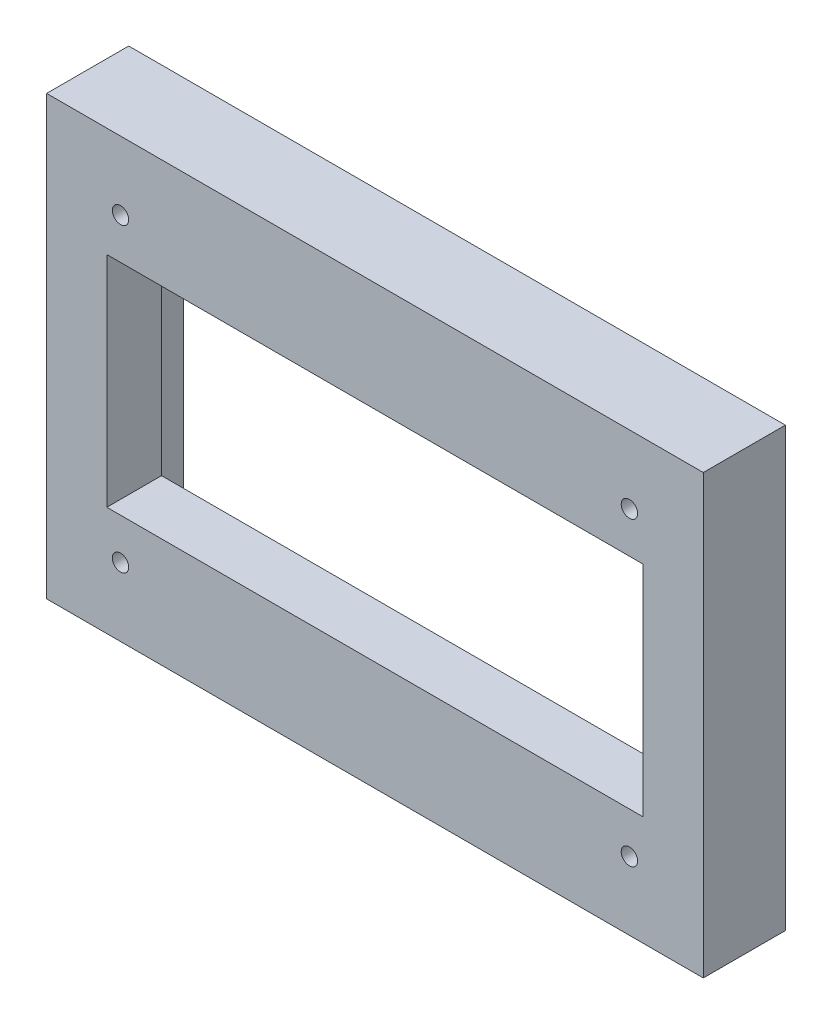
ISO-10303-21;
HEADER;
FILE_DESCRIPTION(('STEP AP214'),'2;1');
FILE_NAME('part.step','',(''),(''),'','','');
FILE_SCHEMA(('AUTOMOTIVE_DESIGN { 1 0 10303 214 1 1 1 1 }'));
ENDSEC;
DATA;
#1=APPLICATION_CONTEXT('core data for automotive mechanical design processes');
#2=APPLICATION_PROTOCOL_DEFINITION('international standard','automotive_design',2000,#1);
#3=PRODUCT_CONTEXT('',#1,'mechanical');
#4=PRODUCT('Part','Part','',(#3));
#5=PRODUCT_RELATED_PRODUCT_CATEGORY('part','',(#4));
#6=PRODUCT_DEFINITION_FORMATION('','',#4);
#7=PRODUCT_DEFINITION_CONTEXT('part definition',#1,'design');
#8=PRODUCT_DEFINITION('design','',#6,#7);
#9=PRODUCT_DEFINITION_SHAPE('','',#8);
#10=(LENGTH_UNIT() NAMED_UNIT(*) SI_UNIT(.MILLI.,.METRE.));
#11=(NAMED_UNIT(*) PLANE_ANGLE_UNIT() SI_UNIT($,.RADIAN.));
#12=(NAMED_UNIT(*) SI_UNIT($,.STERADIAN.) SOLID_ANGLE_UNIT());
#13=UNCERTAINTY_MEASURE_WITH_UNIT(LENGTH_MEASURE(1.E-05),#10,'distance_accuracy_value','');
#14=(GEOMETRIC_REPRESENTATION_CONTEXT(3) GLOBAL_UNCERTAINTY_ASSIGNED_CONTEXT((#13)) GLOBAL_UNIT_ASSIGNED_CONTEXT((#10,
#11,#12)) REPRESENTATION_CONTEXT('',''));
#15=CARTESIAN_POINT('',(0.,0.,0.));
#16=DIRECTION('',(0.,0.,1.));
#17=DIRECTION('',(1.,0.,0.));
#18=AXIS2_PLACEMENT_3D('',#15,#16,#17);
#19=CARTESIAN_POINT('',(60.,40.,-10.));
#20=DIRECTION('',(1.,0.,0.));
#21=DIRECTION('',(0.,1.,0.));
#22=AXIS2_PLACEMENT_3D('',#19,#20,#21);
#23=PLANE('',#22);
#24=DIRECTION('',(0.,1.,0.));
#25=VECTOR('',#24,1.);
#26=CARTESIAN_POINT('',(60.,40.,0.));
#27=LINE('',#26,#25);
#28=CARTESIAN_POINT('',(60.,-40.,0.));
#29=VERTEX_POINT('',#28);
#30=CARTESIAN_POINT('',(60.,40.,0.));
#31=VERTEX_POINT('',#30);
#32=EDGE_CURVE('E209',#29,#31,#27,.T.);
#33=ORIENTED_EDGE('',*,*,#32,.F.);
#34=DIRECTION('',(0.,0.,1.));
#35=VECTOR('',#34,1.);
#36=CARTESIAN_POINT('',(60.,-40.,-10.));
#37=LINE('',#36,#35);
#38=CARTESIAN_POINT('',(60.,-40.,-15.));
#39=VERTEX_POINT('',#38);
#40=EDGE_CURVE('E228',#39,#29,#37,.T.);
#41=ORIENTED_EDGE('',*,*,#40,.F.);
#42=DIRECTION('',(0.,-1.,0.));
#43=VECTOR('',#42,1.);
#44=CARTESIAN_POINT('',(60.,40.,-15.));
#45=LINE('',#44,#43);
#46=CARTESIAN_POINT('',(60.,40.,-15.));
#47=VERTEX_POINT('',#46);
#48=EDGE_CURVE('E168',#47,#39,#45,.T.);
#49=ORIENTED_EDGE('',*,*,#48,.F.);
#50=DIRECTION('',(0.,0.,1.));
#51=VECTOR('',#50,1.);
#52=CARTESIAN_POINT('',(60.,40.,-10.));
#53=LINE('',#52,#51);
#54=EDGE_CURVE('E227',#47,#31,#53,.T.);
#55=ORIENTED_EDGE('',*,*,#54,.T.);
#56=EDGE_LOOP('',(#33,#41,#49,#55));
#57=FACE_BOUND('',#56,.T.);
#58=ADVANCED_FACE('F33',(#57),#23,.T.);
#59=CARTESIAN_POINT('',(-60.,-40.,-10.));
#60=DIRECTION('',(0.,-1.,0.));
#61=DIRECTION('',(0.,0.,-1.));
#62=AXIS2_PLACEMENT_3D('',#59,#60,#61);
#63=PLANE('',#62);
#64=DIRECTION('',(1.,0.,0.));
#65=VECTOR('',#64,1.);
#66=CARTESIAN_POINT('',(-60.,-40.,0.));
#67=LINE('',#66,#65);
#68=CARTESIAN_POINT('',(-60.,-40.,0.));
#69=VERTEX_POINT('',#68);
#70=EDGE_CURVE('E224',#69,#29,#67,.T.);
#71=ORIENTED_EDGE('',*,*,#70,.F.);
#72=DIRECTION('',(0.,0.,1.));
#73=VECTOR('',#72,1.);
#74=CARTESIAN_POINT('',(-60.,-40.,-10.));
#75=LINE('',#74,#73);
#76=CARTESIAN_POINT('',(-60.,-40.,-15.));
#77=VERTEX_POINT('',#76);
#78=EDGE_CURVE('E231',#77,#69,#75,.T.);
#79=ORIENTED_EDGE('',*,*,#78,.F.);
#80=DIRECTION('',(-1.,0.,0.));
#81=VECTOR('',#80,1.);
#82=CARTESIAN_POINT('',(60.,-40.,-15.));
#83=LINE('',#82,#81);
#84=EDGE_CURVE('E171',#39,#77,#83,.T.);
#85=ORIENTED_EDGE('',*,*,#84,.F.);
#86=ORIENTED_EDGE('',*,*,#40,.T.);
#87=EDGE_LOOP('',(#71,#79,#85,#86));
#88=FACE_BOUND('',#87,.T.);
#89=ADVANCED_FACE('F270',(#88),#63,.T.);
#90=CARTESIAN_POINT('',(-60.,40.,-10.));
#91=DIRECTION('',(-1.,0.,0.));
#92=DIRECTION('',(0.,-1.,0.));
#93=AXIS2_PLACEMENT_3D('',#90,#91,#92);
#94=PLANE('',#93);
#95=DIRECTION('',(0.,-1.,0.));
#96=VECTOR('',#95,1.);
#97=CARTESIAN_POINT('',(-60.,40.,0.));
#98=LINE('',#97,#96);
#99=CARTESIAN_POINT('',(-60.,40.,0.));
#100=VERTEX_POINT('',#99);
#101=EDGE_CURVE('E221',#100,#69,#98,.T.);
#102=ORIENTED_EDGE('',*,*,#101,.F.);
#103=DIRECTION('',(0.,0.,1.));
#104=VECTOR('',#103,1.);
#105=CARTESIAN_POINT('',(-60.,40.,-10.));
#106=LINE('',#105,#104);
#107=CARTESIAN_POINT('',(-60.,40.,-15.));
#108=VERTEX_POINT('',#107);
#109=EDGE_CURVE('E233',#108,#100,#106,.T.);
#110=ORIENTED_EDGE('',*,*,#109,.F.);
#111=DIRECTION('',(0.,1.,0.));
#112=VECTOR('',#111,1.);
#113=CARTESIAN_POINT('',(-60.,40.,-15.));
#114=LINE('',#113,#112);
#115=EDGE_CURVE('E161',#77,#108,#114,.T.);
#116=ORIENTED_EDGE('',*,*,#115,.F.);
#117=ORIENTED_EDGE('',*,*,#78,.T.);
#118=EDGE_LOOP('',(#102,#110,#116,#117));
#119=FACE_BOUND('',#118,.T.);
#120=ADVANCED_FACE('F275',(#119),#94,.T.);
#121=CARTESIAN_POINT('',(-60.,40.,-10.));
#122=DIRECTION('',(0.,1.,0.));
#123=DIRECTION('',(0.,0.,1.));
#124=AXIS2_PLACEMENT_3D('',#121,#122,#123);
#125=PLANE('',#124);
#126=DIRECTION('',(-1.,0.,0.));
#127=VECTOR('',#126,1.);
#128=CARTESIAN_POINT('',(-60.,40.,0.));
#129=LINE('',#128,#127);
#130=EDGE_CURVE('E218',#31,#100,#129,.T.);
#131=ORIENTED_EDGE('',*,*,#130,.F.);
#132=ORIENTED_EDGE('',*,*,#54,.F.);
#133=DIRECTION('',(1.,0.,0.));
#134=VECTOR('',#133,1.);
#135=CARTESIAN_POINT('',(60.,40.,-15.));
#136=LINE('',#135,#134);
#137=EDGE_CURVE('E164',#108,#47,#136,.T.);
#138=ORIENTED_EDGE('',*,*,#137,.F.);
#139=ORIENTED_EDGE('',*,*,#109,.T.);
#140=EDGE_LOOP('',(#131,#132,#138,#139));
#141=FACE_BOUND('',#140,.T.);
#142=ADVANCED_FACE('F265',(#141),#125,.T.);
#143=CARTESIAN_POINT('',(0.,0.,0.));
#144=DIRECTION('',(0.,0.,1.));
#145=DIRECTION('',(1.,0.,0.));
#146=AXIS2_PLACEMENT_3D('',#143,#144,#145);
#147=PLANE('',#146);
#148=CARTESIAN_POINT('',(-46.4999999999994,-27.5,0.));
#149=DIRECTION('',(0.,0.,1.));
#150=DIRECTION('',(1.,0.,0.));
#151=AXIS2_PLACEMENT_3D('',#148,#149,#150);
#152=CIRCLE('',#151,1.5);
#153=CARTESIAN_POINT('',(-44.9999999999994,-27.5,0.));
#154=VERTEX_POINT('',#153);
#155=EDGE_CURVE('E174',#154,#154,#152,.T.);
#156=ORIENTED_EDGE('',*,*,#155,.F.);
#157=EDGE_LOOP('',(#156));
#158=FACE_BOUND('',#157,.T.);
#159=CARTESIAN_POINT('',(46.5000000000006,-27.5,0.));
#160=DIRECTION('',(0.,0.,1.));
#161=DIRECTION('',(1.,0.,0.));
#162=AXIS2_PLACEMENT_3D('',#159,#160,#161);
#163=CIRCLE('',#162,1.5);
#164=CARTESIAN_POINT('',(48.0000000000006,-27.5,0.));
#165=VERTEX_POINT('',#164);
#166=EDGE_CURVE('E179',#165,#165,#163,.T.);
#167=ORIENTED_EDGE('',*,*,#166,.F.);
#168=EDGE_LOOP('',(#167));
#169=FACE_BOUND('',#168,.T.);
#170=CARTESIAN_POINT('',(46.5,27.5,0.));
#171=DIRECTION('',(0.,0.,1.));
#172=DIRECTION('',(1.,0.,0.));
#173=AXIS2_PLACEMENT_3D('',#170,#171,#172);
#174=CIRCLE('',#173,1.5);
#175=CARTESIAN_POINT('',(48.,27.5,0.));
#176=VERTEX_POINT('',#175);
#177=EDGE_CURVE('E175',#176,#176,#174,.T.);
#178=ORIENTED_EDGE('',*,*,#177,.F.);
#179=EDGE_LOOP('',(#178));
#180=FACE_BOUND('',#179,.T.);
#181=CARTESIAN_POINT('',(-46.5,27.5,0.));
#182=DIRECTION('',(0.,0.,1.));
#183=DIRECTION('',(1.,0.,0.));
#184=AXIS2_PLACEMENT_3D('',#181,#182,#183);
#185=CIRCLE('',#184,1.5);
#186=CARTESIAN_POINT('',(-45.,27.5,0.));
#187=VERTEX_POINT('',#186);
#188=EDGE_CURVE('E178',#187,#187,#185,.T.);
#189=ORIENTED_EDGE('',*,*,#188,.F.);
#190=EDGE_LOOP('',(#189));
#191=FACE_BOUND('',#190,.T.);
#192=DIRECTION('',(0.,1.,0.));
#193=VECTOR('',#192,1.);
#194=CARTESIAN_POINT('',(49.,0.,0.));
#195=LINE('',#194,#193);
#196=CARTESIAN_POINT('',(49.,-20.,0.));
#197=VERTEX_POINT('',#196);
#198=CARTESIAN_POINT('',(49.,20.,0.));
#199=VERTEX_POINT('',#198);
#200=EDGE_CURVE('E11',#197,#199,#195,.T.);
#201=ORIENTED_EDGE('',*,*,#200,.F.);
#202=DIRECTION('',(1.,0.,0.));
#203=VECTOR('',#202,1.);
#204=CARTESIAN_POINT('',(0.,-20.,0.));
#205=LINE('',#204,#203);
#206=CARTESIAN_POINT('',(-49.,-20.,0.));
#207=VERTEX_POINT('',#206);
#208=EDGE_CURVE('E230',#207,#197,#205,.T.);
#209=ORIENTED_EDGE('',*,*,#208,.F.);
#210=DIRECTION('',(0.,1.,0.));
#211=VECTOR('',#210,1.);
#212=CARTESIAN_POINT('',(-49.,0.,0.));
#213=LINE('',#212,#211);
#214=CARTESIAN_POINT('',(-49.,20.,0.));
#215=VERTEX_POINT('',#214);
#216=EDGE_CURVE('E237',#207,#215,#213,.T.);
#217=ORIENTED_EDGE('',*,*,#216,.T.);
#218=DIRECTION('',(1.,0.,0.));
#219=VECTOR('',#218,1.);
#220=CARTESIAN_POINT('',(0.,20.,0.));
#221=LINE('',#220,#219);
#222=EDGE_CURVE('E40',#215,#199,#221,.T.);
#223=ORIENTED_EDGE('',*,*,#222,.T.);
#224=EDGE_LOOP('',(#201,#209,#217,#223));
#225=FACE_BOUND('',#224,.T.);
#226=ORIENTED_EDGE('',*,*,#32,.T.);
#227=ORIENTED_EDGE('',*,*,#130,.T.);
#228=ORIENTED_EDGE('',*,*,#101,.T.);
#229=ORIENTED_EDGE('',*,*,#70,.T.);
#230=EDGE_LOOP('',(#226,#227,#228,#229));
#231=FACE_BOUND('',#230,.T.);
#232=ADVANCED_FACE('F242',(#158,#169,#180,#191,#225,#231),#147,.T.);
#233=CARTESIAN_POINT('',(49.,20.,5.));
#234=DIRECTION('',(1.,0.,0.));
#235=DIRECTION('',(0.,1.,0.));
#236=AXIS2_PLACEMENT_3D('',#233,#234,#235);
#237=PLANE('',#236);
#238=ORIENTED_EDGE('',*,*,#200,.T.);
#239=DIRECTION('',(0.,0.,-1.));
#240=VECTOR('',#239,1.);
#241=CARTESIAN_POINT('',(49.,20.,5.));
#242=LINE('',#241,#240);
#243=CARTESIAN_POINT('',(49.,20.,-10.));
#244=VERTEX_POINT('',#243);
#245=EDGE_CURVE('E206',#199,#244,#242,.T.);
#246=ORIENTED_EDGE('',*,*,#245,.T.);
#247=DIRECTION('',(0.,-1.,0.));
#248=VECTOR('',#247,1.);
#249=CARTESIAN_POINT('',(49.,20.,-10.));
#250=LINE('',#249,#248);
#251=CARTESIAN_POINT('',(49.,-20.,-10.));
#252=VERTEX_POINT('',#251);
#253=EDGE_CURVE('E186',#244,#252,#250,.T.);
#254=ORIENTED_EDGE('',*,*,#253,.T.);
#255=DIRECTION('',(0.,0.,-1.));
#256=VECTOR('',#255,1.);
#257=CARTESIAN_POINT('',(49.,-20.,5.));
#258=LINE('',#257,#256);
#259=EDGE_CURVE('E205',#197,#252,#258,.T.);
#260=ORIENTED_EDGE('',*,*,#259,.F.);
#261=EDGE_LOOP('',(#238,#246,#254,#260));
#262=FACE_BOUND('',#261,.T.);
#263=ADVANCED_FACE('F257',(#262),#237,.F.);
#264=CARTESIAN_POINT('',(49.,20.,5.));
#265=DIRECTION('',(0.,-1.,0.));
#266=DIRECTION('',(0.,0.,-1.));
#267=AXIS2_PLACEMENT_3D('',#264,#265,#266);
#268=PLANE('',#267);
#269=DIRECTION('',(0.,0.,-1.));
#270=VECTOR('',#269,1.);
#271=CARTESIAN_POINT('',(-49.,20.,5.));
#272=LINE('',#271,#270);
#273=CARTESIAN_POINT('',(-49.,20.,-10.));
#274=VERTEX_POINT('',#273);
#275=EDGE_CURVE('E210',#215,#274,#272,.T.);
#276=ORIENTED_EDGE('',*,*,#275,.T.);
#277=DIRECTION('',(-1.,0.,0.));
#278=VECTOR('',#277,1.);
#279=CARTESIAN_POINT('',(49.,20.,-10.));
#280=LINE('',#279,#278);
#281=EDGE_CURVE('E203',#244,#274,#280,.T.);
#282=ORIENTED_EDGE('',*,*,#281,.F.);
#283=ORIENTED_EDGE('',*,*,#245,.F.);
#284=ORIENTED_EDGE('',*,*,#222,.F.);
#285=EDGE_LOOP('',(#276,#282,#283,#284));
#286=FACE_BOUND('',#285,.T.);
#287=ADVANCED_FACE('F248',(#286),#268,.T.);
#288=CARTESIAN_POINT('',(-49.,20.,5.));
#289=DIRECTION('',(1.,0.,0.));
#290=DIRECTION('',(0.,0.,-1.));
#291=AXIS2_PLACEMENT_3D('',#288,#289,#290);
#292=PLANE('',#291);
#293=DIRECTION('',(0.,0.,-1.));
#294=VECTOR('',#293,1.);
#295=CARTESIAN_POINT('',(-49.,-20.,5.));
#296=LINE('',#295,#294);
#297=CARTESIAN_POINT('',(-49.,-20.,-10.));
#298=VERTEX_POINT('',#297);
#299=EDGE_CURVE('E55',#207,#298,#296,.T.);
#300=ORIENTED_EDGE('',*,*,#299,.T.);
#301=DIRECTION('',(0.,-1.,0.));
#302=VECTOR('',#301,1.);
#303=CARTESIAN_POINT('',(-49.,20.,-10.));
#304=LINE('',#303,#302);
#305=EDGE_CURVE('E201',#274,#298,#304,.T.);
#306=ORIENTED_EDGE('',*,*,#305,.F.);
#307=ORIENTED_EDGE('',*,*,#275,.F.);
#308=ORIENTED_EDGE('',*,*,#216,.F.);
#309=EDGE_LOOP('',(#300,#306,#307,#308));
#310=FACE_BOUND('',#309,.T.);
#311=ADVANCED_FACE('F252',(#310),#292,.T.);
#312=CARTESIAN_POINT('',(49.,-20.,5.));
#313=DIRECTION('',(0.,-1.,0.));
#314=DIRECTION('',(0.,0.,-1.));
#315=AXIS2_PLACEMENT_3D('',#312,#313,#314);
#316=PLANE('',#315);
#317=ORIENTED_EDGE('',*,*,#208,.T.);
#318=ORIENTED_EDGE('',*,*,#259,.T.);
#319=DIRECTION('',(-1.,0.,0.));
#320=VECTOR('',#319,1.);
#321=CARTESIAN_POINT('',(49.,-20.,-10.));
#322=LINE('',#321,#320);
#323=EDGE_CURVE('E199',#252,#298,#322,.T.);
#324=ORIENTED_EDGE('',*,*,#323,.T.);
#325=ORIENTED_EDGE('',*,*,#299,.F.);
#326=EDGE_LOOP('',(#317,#318,#324,#325));
#327=FACE_BOUND('',#326,.T.);
#328=ADVANCED_FACE('F254',(#327),#316,.F.);
#329=CARTESIAN_POINT('',(-46.5,27.5,-15.));
#330=DIRECTION('',(0.,0.,1.));
#331=DIRECTION('',(1.,0.,0.));
#332=AXIS2_PLACEMENT_3D('',#329,#330,#331);
#333=CYLINDRICAL_SURFACE('',#332,1.5);
#334=ORIENTED_EDGE('',*,*,#188,.T.);
#335=EDGE_LOOP('',(#334));
#336=FACE_BOUND('',#335,.T.);
#337=CARTESIAN_POINT('',(-46.5,27.5,-10.));
#338=DIRECTION('',(0.,0.,1.));
#339=DIRECTION('',(1.,0.,0.));
#340=AXIS2_PLACEMENT_3D('',#337,#338,#339);
#341=CIRCLE('',#340,1.5);
#342=CARTESIAN_POINT('',(-45.,27.5,-10.));
#343=VERTEX_POINT('',#342);
#344=EDGE_CURVE('E165',#343,#343,#341,.T.);
#345=ORIENTED_EDGE('',*,*,#344,.F.);
#346=EDGE_LOOP('',(#345));
#347=FACE_BOUND('',#346,.T.);
#348=ADVANCED_FACE('F338',(#336,#347),#333,.F.);
#349=CARTESIAN_POINT('',(46.5,27.5,-15.));
#350=DIRECTION('',(0.,0.,1.));
#351=DIRECTION('',(1.,0.,0.));
#352=AXIS2_PLACEMENT_3D('',#349,#350,#351);
#353=CYLINDRICAL_SURFACE('',#352,1.5);
#354=ORIENTED_EDGE('',*,*,#177,.T.);
#355=EDGE_LOOP('',(#354));
#356=FACE_BOUND('',#355,.T.);
#357=CARTESIAN_POINT('',(46.5,27.5,-10.));
#358=DIRECTION('',(0.,0.,1.));
#359=DIRECTION('',(1.,0.,0.));
#360=AXIS2_PLACEMENT_3D('',#357,#358,#359);
#361=CIRCLE('',#360,1.5);
#362=CARTESIAN_POINT('',(48.,27.5,-10.));
#363=VERTEX_POINT('',#362);
#364=EDGE_CURVE('E189',#363,#363,#361,.T.);
#365=ORIENTED_EDGE('',*,*,#364,.F.);
#366=EDGE_LOOP('',(#365));
#367=FACE_BOUND('',#366,.T.);
#368=ADVANCED_FACE('F328',(#356,#367),#353,.F.);
#369=CARTESIAN_POINT('',(46.5000000000006,-27.5,-15.));
#370=DIRECTION('',(0.,0.,1.));
#371=DIRECTION('',(1.,0.,0.));
#372=AXIS2_PLACEMENT_3D('',#369,#370,#371);
#373=CYLINDRICAL_SURFACE('',#372,1.5);
#374=ORIENTED_EDGE('',*,*,#166,.T.);
#375=EDGE_LOOP('',(#374));
#376=FACE_BOUND('',#375,.T.);
#377=CARTESIAN_POINT('',(46.5000000000006,-27.5,-10.));
#378=DIRECTION('',(0.,0.,1.));
#379=DIRECTION('',(1.,0.,0.));
#380=AXIS2_PLACEMENT_3D('',#377,#378,#379);
#381=CIRCLE('',#380,1.5);
#382=CARTESIAN_POINT('',(48.0000000000006,-27.5,-10.));
#383=VERTEX_POINT('',#382);
#384=EDGE_CURVE('E192',#383,#383,#381,.T.);
#385=ORIENTED_EDGE('',*,*,#384,.F.);
#386=EDGE_LOOP('',(#385));
#387=FACE_BOUND('',#386,.T.);
#388=ADVANCED_FACE('F317',(#376,#387),#373,.F.);
#389=CARTESIAN_POINT('',(-46.4999999999994,-27.5,-15.));
#390=DIRECTION('',(0.,0.,1.));
#391=DIRECTION('',(1.,0.,0.));
#392=AXIS2_PLACEMENT_3D('',#389,#390,#391);
#393=CYLINDRICAL_SURFACE('',#392,1.5);
#394=ORIENTED_EDGE('',*,*,#155,.T.);
#395=EDGE_LOOP('',(#394));
#396=FACE_BOUND('',#395,.T.);
#397=CARTESIAN_POINT('',(-46.4999999999994,-27.5,-10.));
#398=DIRECTION('',(0.,0.,1.));
#399=DIRECTION('',(1.,0.,0.));
#400=AXIS2_PLACEMENT_3D('',#397,#398,#399);
#401=CIRCLE('',#400,1.5);
#402=CARTESIAN_POINT('',(-44.9999999999994,-27.5,-10.));
#403=VERTEX_POINT('',#402);
#404=EDGE_CURVE('E157',#403,#403,#401,.T.);
#405=ORIENTED_EDGE('',*,*,#404,.F.);
#406=EDGE_LOOP('',(#405));
#407=FACE_BOUND('',#406,.T.);
#408=ADVANCED_FACE('F313',(#396,#407),#393,.F.);
#409=CARTESIAN_POINT('',(0.,0.,-15.));
#410=DIRECTION('',(0.,0.,-1.));
#411=DIRECTION('',(-1.,0.,0.));
#412=AXIS2_PLACEMENT_3D('',#409,#410,#411);
#413=PLANE('',#412);
#414=DIRECTION('',(0.,1.,0.));
#415=VECTOR('',#414,1.);
#416=CARTESIAN_POINT('',(-50.,30.,-15.));
#417=LINE('',#416,#415);
#418=CARTESIAN_POINT('',(-50.,-30.,-15.));
#419=VERTEX_POINT('',#418);
#420=CARTESIAN_POINT('',(-50.,30.,-15.));
#421=VERTEX_POINT('',#420);
#422=EDGE_CURVE('E47',#419,#421,#417,.T.);
#423=ORIENTED_EDGE('',*,*,#422,.F.);
#424=DIRECTION('',(-1.,0.,0.));
#425=VECTOR('',#424,1.);
#426=CARTESIAN_POINT('',(50.,-30.,-15.));
#427=LINE('',#426,#425);
#428=CARTESIAN_POINT('',(50.,-30.,-15.));
#429=VERTEX_POINT('',#428);
#430=EDGE_CURVE('E142',#429,#419,#427,.T.);
#431=ORIENTED_EDGE('',*,*,#430,.F.);
#432=DIRECTION('',(0.,-1.,0.));
#433=VECTOR('',#432,1.);
#434=CARTESIAN_POINT('',(50.,30.,-15.));
#435=LINE('',#434,#433);
#436=CARTESIAN_POINT('',(50.,30.,-15.));
#437=VERTEX_POINT('',#436);
#438=EDGE_CURVE('E145',#437,#429,#435,.T.);
#439=ORIENTED_EDGE('',*,*,#438,.F.);
#440=DIRECTION('',(1.,0.,0.));
#441=VECTOR('',#440,1.);
#442=CARTESIAN_POINT('',(50.,30.,-15.));
#443=LINE('',#442,#441);
#444=EDGE_CURVE('E151',#421,#437,#443,.T.);
#445=ORIENTED_EDGE('',*,*,#444,.F.);
#446=EDGE_LOOP('',(#423,#431,#439,#445));
#447=FACE_BOUND('',#446,.T.);
#448=ORIENTED_EDGE('',*,*,#115,.T.);
#449=ORIENTED_EDGE('',*,*,#137,.T.);
#450=ORIENTED_EDGE('',*,*,#48,.T.);
#451=ORIENTED_EDGE('',*,*,#84,.T.);
#452=EDGE_LOOP('',(#448,#449,#450,#451));
#453=FACE_BOUND('',#452,.T.);
#454=ADVANCED_FACE('F286',(#447,#453),#413,.T.);
#455=CARTESIAN_POINT('',(0.,0.,-10.));
#456=DIRECTION('',(0.,0.,-1.));
#457=DIRECTION('',(-1.,0.,0.));
#458=AXIS2_PLACEMENT_3D('',#455,#456,#457);
#459=PLANE('',#458);
#460=ORIENTED_EDGE('',*,*,#253,.F.);
#461=ORIENTED_EDGE('',*,*,#281,.T.);
#462=ORIENTED_EDGE('',*,*,#305,.T.);
#463=ORIENTED_EDGE('',*,*,#323,.F.);
#464=EDGE_LOOP('',(#460,#461,#462,#463));
#465=FACE_BOUND('',#464,.T.);
#466=DIRECTION('',(0.,1.,0.));
#467=VECTOR('',#466,1.);
#468=CARTESIAN_POINT('',(-50.,30.,-10.));
#469=LINE('',#468,#467);
#470=CARTESIAN_POINT('',(-50.,-30.,-10.));
#471=VERTEX_POINT('',#470);
#472=CARTESIAN_POINT('',(-50.,30.,-10.));
#473=VERTEX_POINT('',#472);
#474=EDGE_CURVE('E123',#471,#473,#469,.T.);
#475=ORIENTED_EDGE('',*,*,#474,.T.);
#476=DIRECTION('',(1.,0.,0.));
#477=VECTOR('',#476,1.);
#478=CARTESIAN_POINT('',(50.,30.,-10.));
#479=LINE('',#478,#477);
#480=CARTESIAN_POINT('',(50.,30.,-10.));
#481=VERTEX_POINT('',#480);
#482=EDGE_CURVE('E132',#473,#481,#479,.T.);
#483=ORIENTED_EDGE('',*,*,#482,.T.);
#484=DIRECTION('',(0.,-1.,0.));
#485=VECTOR('',#484,1.);
#486=CARTESIAN_POINT('',(50.,30.,-10.));
#487=LINE('',#486,#485);
#488=CARTESIAN_POINT('',(50.,-30.,-10.));
#489=VERTEX_POINT('',#488);
#490=EDGE_CURVE('E137',#481,#489,#487,.T.);
#491=ORIENTED_EDGE('',*,*,#490,.T.);
#492=DIRECTION('',(-1.,0.,0.));
#493=VECTOR('',#492,1.);
#494=CARTESIAN_POINT('',(50.,-30.,-10.));
#495=LINE('',#494,#493);
#496=EDGE_CURVE('E129',#489,#471,#495,.T.);
#497=ORIENTED_EDGE('',*,*,#496,.T.);
#498=EDGE_LOOP('',(#475,#483,#491,#497));
#499=FACE_BOUND('',#498,.T.);
#500=ORIENTED_EDGE('',*,*,#404,.T.);
#501=EDGE_LOOP('',(#500));
#502=FACE_BOUND('',#501,.T.);
#503=ORIENTED_EDGE('',*,*,#384,.T.);
#504=EDGE_LOOP('',(#503));
#505=FACE_BOUND('',#504,.T.);
#506=ORIENTED_EDGE('',*,*,#364,.T.);
#507=EDGE_LOOP('',(#506));
#508=FACE_BOUND('',#507,.T.);
#509=ORIENTED_EDGE('',*,*,#344,.T.);
#510=EDGE_LOOP('',(#509));
#511=FACE_BOUND('',#510,.T.);
#512=ADVANCED_FACE('F139',(#465,#499,#502,#505,#508,#511),#459,.T.);
#513=CARTESIAN_POINT('',(-50.,30.,-10.));
#514=DIRECTION('',(-1.,0.,0.));
#515=DIRECTION('',(0.,-1.,0.));
#516=AXIS2_PLACEMENT_3D('',#513,#514,#515);
#517=PLANE('',#516);
#518=ORIENTED_EDGE('',*,*,#422,.T.);
#519=DIRECTION('',(0.,0.,-1.));
#520=VECTOR('',#519,1.);
#521=CARTESIAN_POINT('',(-50.,30.,-10.));
#522=LINE('',#521,#520);
#523=EDGE_CURVE('E119',#473,#421,#522,.T.);
#524=ORIENTED_EDGE('',*,*,#523,.F.);
#525=ORIENTED_EDGE('',*,*,#474,.F.);
#526=DIRECTION('',(0.,0.,-1.));
#527=VECTOR('',#526,1.);
#528=CARTESIAN_POINT('',(-50.,-30.,-10.));
#529=LINE('',#528,#527);
#530=EDGE_CURVE('E155',#471,#419,#529,.T.);
#531=ORIENTED_EDGE('',*,*,#530,.T.);
#532=EDGE_LOOP('',(#518,#524,#525,#531));
#533=FACE_BOUND('',#532,.T.);
#534=ADVANCED_FACE('F121',(#533),#517,.F.);
#535=CARTESIAN_POINT('',(50.,-30.,-10.));
#536=DIRECTION('',(0.,-1.,0.));
#537=DIRECTION('',(0.,0.,-1.));
#538=AXIS2_PLACEMENT_3D('',#535,#536,#537);
#539=PLANE('',#538);
#540=ORIENTED_EDGE('',*,*,#430,.T.);
#541=ORIENTED_EDGE('',*,*,#530,.F.);
#542=ORIENTED_EDGE('',*,*,#496,.F.);
#543=DIRECTION('',(0.,0.,-1.));
#544=VECTOR('',#543,1.);
#545=CARTESIAN_POINT('',(50.,-30.,-10.));
#546=LINE('',#545,#544);
#547=EDGE_CURVE('E158',#489,#429,#546,.T.);
#548=ORIENTED_EDGE('',*,*,#547,.T.);
#549=EDGE_LOOP('',(#540,#541,#542,#548));
#550=FACE_BOUND('',#549,.T.);
#551=ADVANCED_FACE('F407',(#550),#539,.F.);
#552=CARTESIAN_POINT('',(50.,30.,-10.));
#553=DIRECTION('',(1.,0.,0.));
#554=DIRECTION('',(0.,1.,0.));
#555=AXIS2_PLACEMENT_3D('',#552,#553,#554);
#556=PLANE('',#555);
#557=ORIENTED_EDGE('',*,*,#438,.T.);
#558=ORIENTED_EDGE('',*,*,#547,.F.);
#559=ORIENTED_EDGE('',*,*,#490,.F.);
#560=DIRECTION('',(0.,0.,-1.));
#561=VECTOR('',#560,1.);
#562=CARTESIAN_POINT('',(50.,30.,-10.));
#563=LINE('',#562,#561);
#564=EDGE_CURVE('E128',#481,#437,#563,.T.);
#565=ORIENTED_EDGE('',*,*,#564,.T.);
#566=EDGE_LOOP('',(#557,#558,#559,#565));
#567=FACE_BOUND('',#566,.T.);
#568=ADVANCED_FACE('F416',(#567),#556,.F.);
#569=CARTESIAN_POINT('',(50.,30.,-10.));
#570=DIRECTION('',(0.,1.,0.));
#571=DIRECTION('',(0.,0.,1.));
#572=AXIS2_PLACEMENT_3D('',#569,#570,#571);
#573=PLANE('',#572);
#574=ORIENTED_EDGE('',*,*,#444,.T.);
#575=ORIENTED_EDGE('',*,*,#564,.F.);
#576=ORIENTED_EDGE('',*,*,#482,.F.);
#577=ORIENTED_EDGE('',*,*,#523,.T.);
#578=EDGE_LOOP('',(#574,#575,#576,#577));
#579=FACE_BOUND('',#578,.T.);
#580=ADVANCED_FACE('F133',(#579),#573,.F.);
#581=CLOSED_SHELL('',(#58,#89,#120,#142,#232,#263,#287,#311,#328,#348,#368,#388,#408,#454,#512,
#534,#551,#568,#580));
#582=MANIFOLD_SOLID_BREP('B2',#581);
#583=ADVANCED_BREP_SHAPE_REPRESENTATION('',(#18,#582),#14);
#584=SHAPE_DEFINITION_REPRESENTATION(#9,#583);
ENDSEC;
END-ISO-10303-21;
